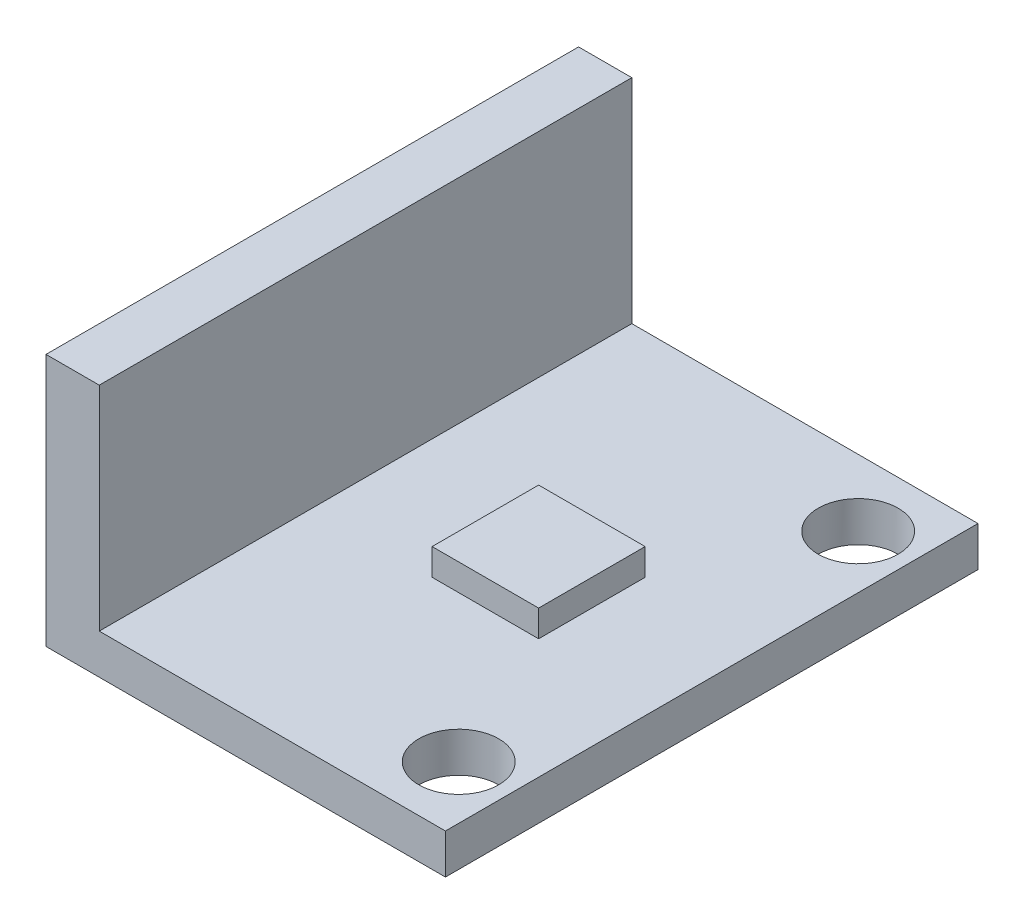
ISO-10303-21;
HEADER;
FILE_DESCRIPTION(('STEP AP214'),'2;1');
FILE_NAME('part.step','',(''),(''),'','','');
FILE_SCHEMA(('AUTOMOTIVE_DESIGN { 1 0 10303 214 1 1 1 1 }'));
ENDSEC;
DATA;
#1=APPLICATION_CONTEXT('core data for automotive mechanical design processes');
#2=APPLICATION_PROTOCOL_DEFINITION('international standard','automotive_design',2000,#1);
#3=PRODUCT_CONTEXT('',#1,'mechanical');
#4=PRODUCT('Part','Part','',(#3));
#5=PRODUCT_RELATED_PRODUCT_CATEGORY('part','',(#4));
#6=PRODUCT_DEFINITION_FORMATION('','',#4);
#7=PRODUCT_DEFINITION_CONTEXT('part definition',#1,'design');
#8=PRODUCT_DEFINITION('design','',#6,#7);
#9=PRODUCT_DEFINITION_SHAPE('','',#8);
#10=(LENGTH_UNIT() NAMED_UNIT(*) SI_UNIT(.MILLI.,.METRE.));
#11=(NAMED_UNIT(*) PLANE_ANGLE_UNIT() SI_UNIT($,.RADIAN.));
#12=(NAMED_UNIT(*) SI_UNIT($,.STERADIAN.) SOLID_ANGLE_UNIT());
#13=UNCERTAINTY_MEASURE_WITH_UNIT(LENGTH_MEASURE(1.E-05),#10,'distance_accuracy_value','');
#14=(GEOMETRIC_REPRESENTATION_CONTEXT(3) GLOBAL_UNCERTAINTY_ASSIGNED_CONTEXT((#13)) GLOBAL_UNIT_ASSIGNED_CONTEXT((#10,
#11,#12)) REPRESENTATION_CONTEXT('',''));
#15=CARTESIAN_POINT('',(0.,0.,0.));
#16=DIRECTION('',(0.,0.,1.));
#17=DIRECTION('',(1.,0.,0.));
#18=AXIS2_PLACEMENT_3D('',#15,#16,#17);
#19=CARTESIAN_POINT('',(0.,1.5,0.));
#20=DIRECTION('',(0.,-1.,0.));
#21=DIRECTION('',(0.,0.,-1.));
#22=AXIS2_PLACEMENT_3D('',#19,#20,#21);
#23=PLANE('',#22);
#24=DIRECTION('',(-1.,0.,0.));
#25=VECTOR('',#24,1.);
#26=CARTESIAN_POINT('',(-7.5,1.5,-10.));
#27=LINE('',#26,#25);
#28=CARTESIAN_POINT('',(7.5,1.5,-10.));
#29=VERTEX_POINT('',#28);
#30=CARTESIAN_POINT('',(-5.5,1.5,-10.));
#31=VERTEX_POINT('',#30);
#32=EDGE_CURVE('E193',#29,#31,#27,.T.);
#33=ORIENTED_EDGE('',*,*,#32,.T.);
#34=DIRECTION('',(0.,0.,1.));
#35=VECTOR('',#34,1.);
#36=CARTESIAN_POINT('',(-5.5,1.5,-10.));
#37=LINE('',#36,#35);
#38=CARTESIAN_POINT('',(-5.5,1.5,10.));
#39=VERTEX_POINT('',#38);
#40=EDGE_CURVE('E141',#31,#39,#37,.T.);
#41=ORIENTED_EDGE('',*,*,#40,.T.);
#42=DIRECTION('',(1.,0.,0.));
#43=VECTOR('',#42,1.);
#44=CARTESIAN_POINT('',(-7.5,1.5,10.));
#45=LINE('',#44,#43);
#46=CARTESIAN_POINT('',(7.5,1.5,10.));
#47=VERTEX_POINT('',#46);
#48=EDGE_CURVE('E198',#39,#47,#45,.T.);
#49=ORIENTED_EDGE('',*,*,#48,.T.);
#50=DIRECTION('',(0.,0.,-1.));
#51=VECTOR('',#50,1.);
#52=CARTESIAN_POINT('',(7.5,1.5,10.));
#53=LINE('',#52,#51);
#54=EDGE_CURVE('E189',#47,#29,#53,.T.);
#55=ORIENTED_EDGE('',*,*,#54,.T.);
#56=EDGE_LOOP('',(#33,#41,#49,#55));
#57=FACE_BOUND('',#56,.T.);
#58=CARTESIAN_POINT('',(5.5,1.5,-7.5));
#59=DIRECTION('',(0.,1.,0.));
#60=DIRECTION('',(0.,0.,1.));
#61=AXIS2_PLACEMENT_3D('',#58,#59,#60);
#62=CIRCLE('',#61,1.5);
#63=CARTESIAN_POINT('',(5.5,1.5,-6.));
#64=VERTEX_POINT('',#63);
#65=EDGE_CURVE('E181',#64,#64,#62,.T.);
#66=ORIENTED_EDGE('',*,*,#65,.F.);
#67=EDGE_LOOP('',(#66));
#68=FACE_BOUND('',#67,.T.);
#69=CARTESIAN_POINT('',(5.5,1.5,7.5));
#70=DIRECTION('',(0.,-1.,0.));
#71=DIRECTION('',(0.,0.,-1.));
#72=AXIS2_PLACEMENT_3D('',#69,#70,#71);
#73=CIRCLE('',#72,1.5);
#74=CARTESIAN_POINT('',(5.5,1.5,6.));
#75=VERTEX_POINT('',#74);
#76=EDGE_CURVE('E170',#75,#75,#73,.T.);
#77=ORIENTED_EDGE('',*,*,#76,.T.);
#78=EDGE_LOOP('',(#77));
#79=FACE_BOUND('',#78,.T.);
#80=DIRECTION('',(0.,0.,1.));
#81=VECTOR('',#80,1.);
#82=CARTESIAN_POINT('',(-1.,1.5,-2.));
#83=LINE('',#82,#81);
#84=CARTESIAN_POINT('',(-1.,1.5,-2.));
#85=VERTEX_POINT('',#84);
#86=CARTESIAN_POINT('',(-1.,1.5,2.));
#87=VERTEX_POINT('',#86);
#88=EDGE_CURVE('E139',#85,#87,#83,.T.);
#89=ORIENTED_EDGE('',*,*,#88,.F.);
#90=DIRECTION('',(-1.,0.,0.));
#91=VECTOR('',#90,1.);
#92=CARTESIAN_POINT('',(-1.,1.5,-2.));
#93=LINE('',#92,#91);
#94=CARTESIAN_POINT('',(3.,1.5,-2.));
#95=VERTEX_POINT('',#94);
#96=EDGE_CURVE('E136',#95,#85,#93,.T.);
#97=ORIENTED_EDGE('',*,*,#96,.F.);
#98=DIRECTION('',(0.,0.,-1.));
#99=VECTOR('',#98,1.);
#100=CARTESIAN_POINT('',(3.,1.5,-2.));
#101=LINE('',#100,#99);
#102=CARTESIAN_POINT('',(3.,1.5,2.));
#103=VERTEX_POINT('',#102);
#104=EDGE_CURVE('E60',#103,#95,#101,.T.);
#105=ORIENTED_EDGE('',*,*,#104,.F.);
#106=DIRECTION('',(1.,0.,0.));
#107=VECTOR('',#106,1.);
#108=CARTESIAN_POINT('',(-1.,1.5,2.));
#109=LINE('',#108,#107);
#110=EDGE_CURVE('E55',#87,#103,#109,.T.);
#111=ORIENTED_EDGE('',*,*,#110,.F.);
#112=EDGE_LOOP('',(#89,#97,#105,#111));
#113=FACE_BOUND('',#112,.T.);
#114=ADVANCED_FACE('F39',(#57,#68,#79,#113),#23,.F.);
#115=CARTESIAN_POINT('',(7.5,1.5,10.));
#116=DIRECTION('',(-1.,0.,0.));
#117=DIRECTION('',(0.,0.,1.));
#118=AXIS2_PLACEMENT_3D('',#115,#116,#117);
#119=PLANE('',#118);
#120=DIRECTION('',(0.,0.,-1.));
#121=VECTOR('',#120,1.);
#122=CARTESIAN_POINT('',(7.5,0.,10.));
#123=LINE('',#122,#121);
#124=CARTESIAN_POINT('',(7.5,0.,10.));
#125=VERTEX_POINT('',#124);
#126=CARTESIAN_POINT('',(7.5,0.,-10.));
#127=VERTEX_POINT('',#126);
#128=EDGE_CURVE('E185',#125,#127,#123,.T.);
#129=ORIENTED_EDGE('',*,*,#128,.T.);
#130=DIRECTION('',(0.,-1.,0.));
#131=VECTOR('',#130,1.);
#132=CARTESIAN_POINT('',(7.5,1.5,-10.));
#133=LINE('',#132,#131);
#134=EDGE_CURVE('E11',#29,#127,#133,.T.);
#135=ORIENTED_EDGE('',*,*,#134,.F.);
#136=ORIENTED_EDGE('',*,*,#54,.F.);
#137=DIRECTION('',(0.,-1.,0.));
#138=VECTOR('',#137,1.);
#139=CARTESIAN_POINT('',(7.5,1.5,10.));
#140=LINE('',#139,#138);
#141=EDGE_CURVE('E201',#47,#125,#140,.T.);
#142=ORIENTED_EDGE('',*,*,#141,.T.);
#143=EDGE_LOOP('',(#129,#135,#136,#142));
#144=FACE_BOUND('',#143,.T.);
#145=ADVANCED_FACE('F41',(#144),#119,.F.);
#146=CARTESIAN_POINT('',(-7.5,1.5,-10.));
#147=DIRECTION('',(0.,0.,1.));
#148=DIRECTION('',(1.,0.,0.));
#149=AXIS2_PLACEMENT_3D('',#146,#147,#148);
#150=PLANE('',#149);
#151=DIRECTION('',(-1.,0.,0.));
#152=VECTOR('',#151,1.);
#153=CARTESIAN_POINT('',(-7.5,0.,-10.));
#154=LINE('',#153,#152);
#155=CARTESIAN_POINT('',(-7.5,0.,-10.));
#156=VERTEX_POINT('',#155);
#157=EDGE_CURVE('E205',#127,#156,#154,.T.);
#158=ORIENTED_EDGE('',*,*,#157,.T.);
#159=DIRECTION('',(0.,-1.,0.));
#160=VECTOR('',#159,1.);
#161=CARTESIAN_POINT('',(-7.5,1.5,-10.));
#162=LINE('',#161,#160);
#163=CARTESIAN_POINT('',(-7.5,9.5,-10.));
#164=VERTEX_POINT('',#163);
#165=EDGE_CURVE('E48',#164,#156,#162,.T.);
#166=ORIENTED_EDGE('',*,*,#165,.F.);
#167=DIRECTION('',(1.,0.,0.));
#168=VECTOR('',#167,1.);
#169=CARTESIAN_POINT('',(-7.5,9.5,-10.));
#170=LINE('',#169,#168);
#171=CARTESIAN_POINT('',(-5.5,9.5,-10.));
#172=VERTEX_POINT('',#171);
#173=EDGE_CURVE('E146',#164,#172,#170,.T.);
#174=ORIENTED_EDGE('',*,*,#173,.T.);
#175=DIRECTION('',(0.,-1.,0.));
#176=VECTOR('',#175,1.);
#177=CARTESIAN_POINT('',(-5.5,9.5,-10.));
#178=LINE('',#177,#176);
#179=EDGE_CURVE('E165',#172,#31,#178,.T.);
#180=ORIENTED_EDGE('',*,*,#179,.T.);
#181=ORIENTED_EDGE('',*,*,#32,.F.);
#182=ORIENTED_EDGE('',*,*,#134,.T.);
#183=EDGE_LOOP('',(#158,#166,#174,#180,#181,#182));
#184=FACE_BOUND('',#183,.T.);
#185=ADVANCED_FACE('F248',(#184),#150,.F.);
#186=CARTESIAN_POINT('',(-7.5,1.5,10.));
#187=DIRECTION('',(1.,0.,0.));
#188=DIRECTION('',(0.,0.,-1.));
#189=AXIS2_PLACEMENT_3D('',#186,#187,#188);
#190=PLANE('',#189);
#191=DIRECTION('',(0.,0.,1.));
#192=VECTOR('',#191,1.);
#193=CARTESIAN_POINT('',(-7.5,0.,10.));
#194=LINE('',#193,#192);
#195=CARTESIAN_POINT('',(-7.5,0.,10.));
#196=VERTEX_POINT('',#195);
#197=EDGE_CURVE('E208',#156,#196,#194,.T.);
#198=ORIENTED_EDGE('',*,*,#197,.T.);
#199=DIRECTION('',(0.,-1.,0.));
#200=VECTOR('',#199,1.);
#201=CARTESIAN_POINT('',(-7.5,1.5,10.));
#202=LINE('',#201,#200);
#203=CARTESIAN_POINT('',(-7.5,9.5,10.));
#204=VERTEX_POINT('',#203);
#205=EDGE_CURVE('E216',#204,#196,#202,.T.);
#206=ORIENTED_EDGE('',*,*,#205,.F.);
#207=DIRECTION('',(0.,0.,1.));
#208=VECTOR('',#207,1.);
#209=CARTESIAN_POINT('',(-7.5,9.5,-10.));
#210=LINE('',#209,#208);
#211=EDGE_CURVE('E162',#164,#204,#210,.T.);
#212=ORIENTED_EDGE('',*,*,#211,.F.);
#213=ORIENTED_EDGE('',*,*,#165,.T.);
#214=EDGE_LOOP('',(#198,#206,#212,#213));
#215=FACE_BOUND('',#214,.T.);
#216=ADVANCED_FACE('F224',(#215),#190,.F.);
#217=CARTESIAN_POINT('',(-7.5,1.5,10.));
#218=DIRECTION('',(0.,0.,-1.));
#219=DIRECTION('',(-1.,0.,0.));
#220=AXIS2_PLACEMENT_3D('',#217,#218,#219);
#221=PLANE('',#220);
#222=DIRECTION('',(1.,0.,0.));
#223=VECTOR('',#222,1.);
#224=CARTESIAN_POINT('',(-7.5,0.,10.));
#225=LINE('',#224,#223);
#226=EDGE_CURVE('E194',#196,#125,#225,.T.);
#227=ORIENTED_EDGE('',*,*,#226,.T.);
#228=ORIENTED_EDGE('',*,*,#141,.F.);
#229=ORIENTED_EDGE('',*,*,#48,.F.);
#230=DIRECTION('',(0.,-1.,0.));
#231=VECTOR('',#230,1.);
#232=CARTESIAN_POINT('',(-5.5,9.5,10.));
#233=LINE('',#232,#231);
#234=CARTESIAN_POINT('',(-5.5,9.5,10.));
#235=VERTEX_POINT('',#234);
#236=EDGE_CURVE('E167',#235,#39,#233,.T.);
#237=ORIENTED_EDGE('',*,*,#236,.F.);
#238=DIRECTION('',(1.,0.,0.));
#239=VECTOR('',#238,1.);
#240=CARTESIAN_POINT('',(-7.5,9.5,10.));
#241=LINE('',#240,#239);
#242=EDGE_CURVE('E159',#204,#235,#241,.T.);
#243=ORIENTED_EDGE('',*,*,#242,.F.);
#244=ORIENTED_EDGE('',*,*,#205,.T.);
#245=EDGE_LOOP('',(#227,#228,#229,#237,#243,#244));
#246=FACE_BOUND('',#245,.T.);
#247=ADVANCED_FACE('F233',(#246),#221,.F.);
#248=CARTESIAN_POINT('',(0.,0.,0.));
#249=DIRECTION('',(0.,-1.,0.));
#250=DIRECTION('',(0.,0.,-1.));
#251=AXIS2_PLACEMENT_3D('',#248,#249,#250);
#252=PLANE('',#251);
#253=CARTESIAN_POINT('',(5.5,0.,7.5));
#254=DIRECTION('',(0.,-1.,0.));
#255=DIRECTION('',(0.,0.,-1.));
#256=AXIS2_PLACEMENT_3D('',#253,#254,#255);
#257=CIRCLE('',#256,1.5);
#258=CARTESIAN_POINT('',(5.5,0.,6.));
#259=VERTEX_POINT('',#258);
#260=EDGE_CURVE('E176',#259,#259,#257,.T.);
#261=ORIENTED_EDGE('',*,*,#260,.F.);
#262=EDGE_LOOP('',(#261));
#263=FACE_BOUND('',#262,.T.);
#264=CARTESIAN_POINT('',(5.5,0.,-7.5));
#265=DIRECTION('',(0.,-1.,0.));
#266=DIRECTION('',(0.,0.,-1.));
#267=AXIS2_PLACEMENT_3D('',#264,#265,#266);
#268=CIRCLE('',#267,1.5);
#269=CARTESIAN_POINT('',(5.5,0.,-9.));
#270=VERTEX_POINT('',#269);
#271=EDGE_CURVE('E180',#270,#270,#268,.F.);
#272=ORIENTED_EDGE('',*,*,#271,.T.);
#273=EDGE_LOOP('',(#272));
#274=FACE_BOUND('',#273,.T.);
#275=ORIENTED_EDGE('',*,*,#128,.F.);
#276=ORIENTED_EDGE('',*,*,#226,.F.);
#277=ORIENTED_EDGE('',*,*,#197,.F.);
#278=ORIENTED_EDGE('',*,*,#157,.F.);
#279=EDGE_LOOP('',(#275,#276,#277,#278));
#280=FACE_BOUND('',#279,.T.);
#281=ADVANCED_FACE('F230',(#263,#274,#280),#252,.T.);
#282=CARTESIAN_POINT('',(5.5,-0.000999999999999916,-7.5));
#283=DIRECTION('',(0.,1.,0.));
#284=DIRECTION('',(0.,0.,1.));
#285=AXIS2_PLACEMENT_3D('',#282,#283,#284);
#286=CYLINDRICAL_SURFACE('',#285,1.5);
#287=ORIENTED_EDGE('',*,*,#271,.F.);
#288=EDGE_LOOP('',(#287));
#289=FACE_BOUND('',#288,.T.);
#290=ORIENTED_EDGE('',*,*,#65,.T.);
#291=EDGE_LOOP('',(#290));
#292=FACE_BOUND('',#291,.T.);
#293=ADVANCED_FACE('F261',(#289,#292),#286,.F.);
#294=CARTESIAN_POINT('',(5.5,-0.000999999999999916,7.5));
#295=DIRECTION('',(0.,1.,0.));
#296=DIRECTION('',(0.,0.,1.));
#297=AXIS2_PLACEMENT_3D('',#294,#295,#296);
#298=CYLINDRICAL_SURFACE('',#297,1.5);
#299=ORIENTED_EDGE('',*,*,#260,.T.);
#300=EDGE_LOOP('',(#299));
#301=FACE_BOUND('',#300,.T.);
#302=ORIENTED_EDGE('',*,*,#76,.F.);
#303=EDGE_LOOP('',(#302));
#304=FACE_BOUND('',#303,.T.);
#305=ADVANCED_FACE('F283',(#301,#304),#298,.F.);
#306=CARTESIAN_POINT('',(-5.5,9.5,-10.));
#307=DIRECTION('',(1.,0.,0.));
#308=DIRECTION('',(0.,0.,-1.));
#309=AXIS2_PLACEMENT_3D('',#306,#307,#308);
#310=PLANE('',#309);
#311=ORIENTED_EDGE('',*,*,#40,.F.);
#312=ORIENTED_EDGE('',*,*,#179,.F.);
#313=DIRECTION('',(0.,0.,1.));
#314=VECTOR('',#313,1.);
#315=CARTESIAN_POINT('',(-5.5,9.5,-10.));
#316=LINE('',#315,#314);
#317=EDGE_CURVE('E155',#172,#235,#316,.T.);
#318=ORIENTED_EDGE('',*,*,#317,.T.);
#319=ORIENTED_EDGE('',*,*,#236,.T.);
#320=EDGE_LOOP('',(#311,#312,#318,#319));
#321=FACE_BOUND('',#320,.T.);
#322=ADVANCED_FACE('F245',(#321),#310,.T.);
#323=CARTESIAN_POINT('',(0.,9.5,0.));
#324=DIRECTION('',(0.,-1.,0.));
#325=DIRECTION('',(0.,0.,-1.));
#326=AXIS2_PLACEMENT_3D('',#323,#324,#325);
#327=PLANE('',#326);
#328=ORIENTED_EDGE('',*,*,#173,.F.);
#329=ORIENTED_EDGE('',*,*,#211,.T.);
#330=ORIENTED_EDGE('',*,*,#242,.T.);
#331=ORIENTED_EDGE('',*,*,#317,.F.);
#332=EDGE_LOOP('',(#328,#329,#330,#331));
#333=FACE_BOUND('',#332,.T.);
#334=ADVANCED_FACE('F247',(#333),#327,.F.);
#335=CARTESIAN_POINT('',(-1.,2.5,-2.));
#336=DIRECTION('',(1.,0.,0.));
#337=DIRECTION('',(0.,0.,-1.));
#338=AXIS2_PLACEMENT_3D('',#335,#336,#337);
#339=PLANE('',#338);
#340=ORIENTED_EDGE('',*,*,#88,.T.);
#341=DIRECTION('',(0.,-1.,0.));
#342=VECTOR('',#341,1.);
#343=CARTESIAN_POINT('',(-1.,2.5,2.));
#344=LINE('',#343,#342);
#345=CARTESIAN_POINT('',(-1.,2.5,2.));
#346=VERTEX_POINT('',#345);
#347=EDGE_CURVE('E118',#346,#87,#344,.T.);
#348=ORIENTED_EDGE('',*,*,#347,.F.);
#349=DIRECTION('',(0.,0.,1.));
#350=VECTOR('',#349,1.);
#351=CARTESIAN_POINT('',(-1.,2.5,-2.));
#352=LINE('',#351,#350);
#353=CARTESIAN_POINT('',(-1.,2.5,-2.));
#354=VERTEX_POINT('',#353);
#355=EDGE_CURVE('E126',#354,#346,#352,.T.);
#356=ORIENTED_EDGE('',*,*,#355,.F.);
#357=DIRECTION('',(0.,-1.,0.));
#358=VECTOR('',#357,1.);
#359=CARTESIAN_POINT('',(-1.,2.5,-2.));
#360=LINE('',#359,#358);
#361=EDGE_CURVE('E387',#354,#85,#360,.T.);
#362=ORIENTED_EDGE('',*,*,#361,.T.);
#363=EDGE_LOOP('',(#340,#348,#356,#362));
#364=FACE_BOUND('',#363,.T.);
#365=ADVANCED_FACE('F138',(#364),#339,.F.);
#366=CARTESIAN_POINT('',(-1.,2.5,2.));
#367=DIRECTION('',(0.,0.,-1.));
#368=DIRECTION('',(-1.,0.,0.));
#369=AXIS2_PLACEMENT_3D('',#366,#367,#368);
#370=PLANE('',#369);
#371=ORIENTED_EDGE('',*,*,#110,.T.);
#372=DIRECTION('',(0.,-1.,0.));
#373=VECTOR('',#372,1.);
#374=CARTESIAN_POINT('',(3.,2.5,2.));
#375=LINE('',#374,#373);
#376=CARTESIAN_POINT('',(3.,2.5,2.));
#377=VERTEX_POINT('',#376);
#378=EDGE_CURVE('E121',#377,#103,#375,.T.);
#379=ORIENTED_EDGE('',*,*,#378,.F.);
#380=DIRECTION('',(1.,0.,0.));
#381=VECTOR('',#380,1.);
#382=CARTESIAN_POINT('',(-1.,2.5,2.));
#383=LINE('',#382,#381);
#384=EDGE_CURVE('E114',#346,#377,#383,.T.);
#385=ORIENTED_EDGE('',*,*,#384,.F.);
#386=ORIENTED_EDGE('',*,*,#347,.T.);
#387=EDGE_LOOP('',(#371,#379,#385,#386));
#388=FACE_BOUND('',#387,.T.);
#389=ADVANCED_FACE('F116',(#388),#370,.F.);
#390=CARTESIAN_POINT('',(3.,2.5,-2.));
#391=DIRECTION('',(-1.,0.,0.));
#392=DIRECTION('',(0.,0.,1.));
#393=AXIS2_PLACEMENT_3D('',#390,#391,#392);
#394=PLANE('',#393);
#395=ORIENTED_EDGE('',*,*,#104,.T.);
#396=DIRECTION('',(0.,-1.,0.));
#397=VECTOR('',#396,1.);
#398=CARTESIAN_POINT('',(3.,2.5,-2.));
#399=LINE('',#398,#397);
#400=CARTESIAN_POINT('',(3.,2.5,-2.));
#401=VERTEX_POINT('',#400);
#402=EDGE_CURVE('E148',#401,#95,#399,.T.);
#403=ORIENTED_EDGE('',*,*,#402,.F.);
#404=DIRECTION('',(0.,0.,-1.));
#405=VECTOR('',#404,1.);
#406=CARTESIAN_POINT('',(3.,2.5,-2.));
#407=LINE('',#406,#405);
#408=EDGE_CURVE('E125',#377,#401,#407,.T.);
#409=ORIENTED_EDGE('',*,*,#408,.F.);
#410=ORIENTED_EDGE('',*,*,#378,.T.);
#411=EDGE_LOOP('',(#395,#403,#409,#410));
#412=FACE_BOUND('',#411,.T.);
#413=ADVANCED_FACE('F313',(#412),#394,.F.);
#414=CARTESIAN_POINT('',(-1.,2.5,-2.));
#415=DIRECTION('',(0.,0.,1.));
#416=DIRECTION('',(1.,0.,0.));
#417=AXIS2_PLACEMENT_3D('',#414,#415,#416);
#418=PLANE('',#417);
#419=ORIENTED_EDGE('',*,*,#96,.T.);
#420=ORIENTED_EDGE('',*,*,#361,.F.);
#421=DIRECTION('',(-1.,0.,0.));
#422=VECTOR('',#421,1.);
#423=CARTESIAN_POINT('',(-1.,2.5,-2.));
#424=LINE('',#423,#422);
#425=EDGE_CURVE('E131',#401,#354,#424,.T.);
#426=ORIENTED_EDGE('',*,*,#425,.F.);
#427=ORIENTED_EDGE('',*,*,#402,.T.);
#428=EDGE_LOOP('',(#419,#420,#426,#427));
#429=FACE_BOUND('',#428,.T.);
#430=ADVANCED_FACE('F320',(#429),#418,.F.);
#431=CARTESIAN_POINT('',(0.,2.5,0.));
#432=DIRECTION('',(0.,1.,0.));
#433=DIRECTION('',(0.,0.,1.));
#434=AXIS2_PLACEMENT_3D('',#431,#432,#433);
#435=PLANE('',#434);
#436=ORIENTED_EDGE('',*,*,#355,.T.);
#437=ORIENTED_EDGE('',*,*,#384,.T.);
#438=ORIENTED_EDGE('',*,*,#408,.T.);
#439=ORIENTED_EDGE('',*,*,#425,.T.);
#440=EDGE_LOOP('',(#436,#437,#438,#439));
#441=FACE_BOUND('',#440,.T.);
#442=ADVANCED_FACE('F129',(#441),#435,.T.);
#443=CLOSED_SHELL('',(#114,#145,#185,#216,#247,#281,#293,#305,#322,#334,#365,#389,#413,#430,#442));
#444=MANIFOLD_SOLID_BREP('B2',#443);
#445=ADVANCED_BREP_SHAPE_REPRESENTATION('',(#18,#444),#14);
#446=SHAPE_DEFINITION_REPRESENTATION(#9,#445);
ENDSEC;
END-ISO-10303-21;
